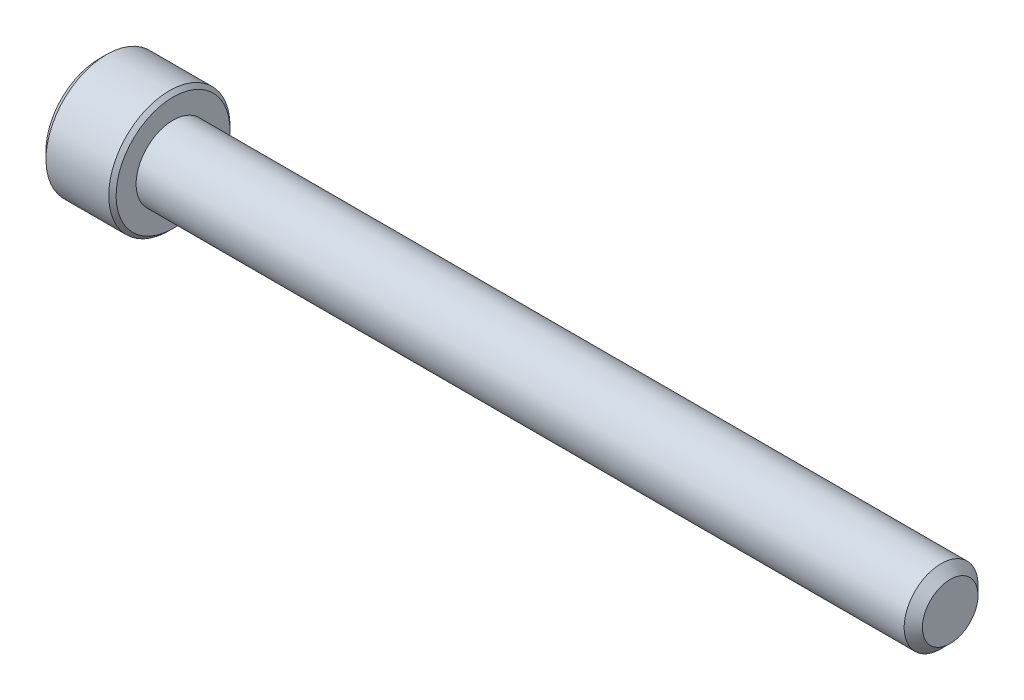
ISO-10303-21;
HEADER;
FILE_DESCRIPTION(('STEP AP214'),'2;1');
FILE_NAME('part.step','',(''),(''),'','','');
FILE_SCHEMA(('AUTOMOTIVE_DESIGN { 1 0 10303 214 1 1 1 1 }'));
ENDSEC;
DATA;
#1=APPLICATION_CONTEXT('core data for automotive mechanical design processes');
#2=APPLICATION_PROTOCOL_DEFINITION('international standard','automotive_design',2000,#1);
#3=PRODUCT_CONTEXT('',#1,'mechanical');
#4=PRODUCT('Part','Part','',(#3));
#5=PRODUCT_RELATED_PRODUCT_CATEGORY('part','',(#4));
#6=PRODUCT_DEFINITION_FORMATION('','',#4);
#7=PRODUCT_DEFINITION_CONTEXT('part definition',#1,'design');
#8=PRODUCT_DEFINITION('design','',#6,#7);
#9=PRODUCT_DEFINITION_SHAPE('','',#8);
#10=(LENGTH_UNIT() NAMED_UNIT(*) SI_UNIT(.MILLI.,.METRE.));
#11=(NAMED_UNIT(*) PLANE_ANGLE_UNIT() SI_UNIT($,.RADIAN.));
#12=(NAMED_UNIT(*) SI_UNIT($,.STERADIAN.) SOLID_ANGLE_UNIT());
#13=UNCERTAINTY_MEASURE_WITH_UNIT(LENGTH_MEASURE(1.E-05),#10,'distance_accuracy_value','');
#14=(GEOMETRIC_REPRESENTATION_CONTEXT(3) GLOBAL_UNCERTAINTY_ASSIGNED_CONTEXT((#13)) GLOBAL_UNIT_ASSIGNED_CONTEXT((#10,
#11,#12)) REPRESENTATION_CONTEXT('',''));
#15=CARTESIAN_POINT('',(0.,0.,0.));
#16=DIRECTION('',(0.,0.,1.));
#17=DIRECTION('',(1.,0.,0.));
#18=AXIS2_PLACEMENT_3D('',#15,#16,#17);
#19=CARTESIAN_POINT('',(-30.226,3.47979999999999,0.));
#20=DIRECTION('',(-1.,0.,0.));
#21=DIRECTION('',(0.,-1.,0.));
#22=AXIS2_PLACEMENT_3D('',#19,#20,#21);
#23=PLANE('',#22);
#24=CARTESIAN_POINT('',(-30.226,0.,0.));
#25=DIRECTION('',(-1.,0.,0.));
#26=DIRECTION('',(0.,-1.,0.));
#27=AXIS2_PLACEMENT_3D('',#24,#25,#26);
#28=CIRCLE('',#27,2.28769270663693);
#29=CARTESIAN_POINT('',(-30.226,-2.28769270663684,-2.28983498828939E-13));
#30=VERTEX_POINT('',#29);
#31=CARTESIAN_POINT('',(-30.226,-1.14384635331858,1.98119999999985));
#32=VERTEX_POINT('',#31);
#33=EDGE_CURVE('E129',#30,#32,#28,.T.);
#34=ORIENTED_EDGE('',*,*,#33,.F.);
#35=CARTESIAN_POINT('',(-30.226,-1.14384635331849,-1.9812));
#36=VERTEX_POINT('',#35);
#37=EDGE_CURVE('E128',#36,#30,#28,.T.);
#38=ORIENTED_EDGE('',*,*,#37,.F.);
#39=CARTESIAN_POINT('',(-30.226,1.14384635331849,-1.9812));
#40=VERTEX_POINT('',#39);
#41=EDGE_CURVE('E98',#40,#36,#28,.T.);
#42=ORIENTED_EDGE('',*,*,#41,.F.);
#43=CARTESIAN_POINT('',(-30.226,2.28769270663702,0.));
#44=VERTEX_POINT('',#43);
#45=EDGE_CURVE('E91',#44,#40,#28,.T.);
#46=ORIENTED_EDGE('',*,*,#45,.F.);
#47=CARTESIAN_POINT('',(-30.226,1.14384635331848,1.9812));
#48=VERTEX_POINT('',#47);
#49=EDGE_CURVE('E52',#48,#44,#28,.T.);
#50=ORIENTED_EDGE('',*,*,#49,.F.);
#51=EDGE_CURVE('E59',#32,#48,#28,.T.);
#52=ORIENTED_EDGE('',*,*,#51,.F.);
#53=EDGE_LOOP('',(#34,#38,#42,#46,#50,#52));
#54=FACE_BOUND('',#53,.T.);
#55=CARTESIAN_POINT('',(-30.226,0.,0.));
#56=DIRECTION('',(1.,0.,0.));
#57=DIRECTION('',(0.,1.,0.));
#58=AXIS2_PLACEMENT_3D('',#55,#56,#57);
#59=CIRCLE('',#58,3.4798);
#60=CARTESIAN_POINT('',(-30.226,3.47979999999999,0.));
#61=VERTEX_POINT('',#60);
#62=EDGE_CURVE('E222',#61,#61,#59,.T.);
#63=ORIENTED_EDGE('',*,*,#62,.F.);
#64=EDGE_LOOP('',(#63));
#65=FACE_BOUND('',#64,.T.);
#66=ADVANCED_FACE('F32',(#54,#65),#23,.T.);
#67=CARTESIAN_POINT('',(-25.4,0.,0.));
#68=DIRECTION('',(1.,0.,0.));
#69=DIRECTION('',(0.,0.,-1.));
#70=AXIS2_PLACEMENT_3D('',#67,#68,#69);
#71=CYLINDRICAL_SURFACE('',#70,2.41299999999999);
#72=CARTESIAN_POINT('',(24.8046875,0.,0.));
#73=DIRECTION('',(1.,0.,0.));
#74=DIRECTION('',(0.,0.,-1.));
#75=AXIS2_PLACEMENT_3D('',#72,#73,#74);
#76=CIRCLE('',#75,2.41299999999999);
#77=CARTESIAN_POINT('',(24.8046875,0.,-2.41299999999999));
#78=VERTEX_POINT('',#77);
#79=EDGE_CURVE('E46',#78,#78,#76,.F.);
#80=ORIENTED_EDGE('',*,*,#79,.T.);
#81=EDGE_LOOP('',(#80));
#82=FACE_BOUND('',#81,.T.);
#83=CARTESIAN_POINT('',(-25.4,0.,0.));
#84=DIRECTION('',(1.,0.,0.));
#85=DIRECTION('',(0.,1.,0.));
#86=AXIS2_PLACEMENT_3D('',#83,#84,#85);
#87=CIRCLE('',#86,2.41299999999999);
#88=CARTESIAN_POINT('',(-25.4,2.41299999999999,0.));
#89=VERTEX_POINT('',#88);
#90=EDGE_CURVE('E215',#89,#89,#87,.F.);
#91=ORIENTED_EDGE('',*,*,#90,.F.);
#92=EDGE_LOOP('',(#91));
#93=FACE_BOUND('',#92,.T.);
#94=ADVANCED_FACE('F195',(#82,#93),#71,.T.);
#95=CARTESIAN_POINT('',(25.4,0.,0.));
#96=DIRECTION('',(1.,0.,0.));
#97=DIRECTION('',(0.,0.,-1.));
#98=AXIS2_PLACEMENT_3D('',#95,#96,#97);
#99=PLANE('',#98);
#100=CARTESIAN_POINT('',(25.4,0.,0.));
#101=DIRECTION('',(1.,0.,0.));
#102=DIRECTION('',(0.,0.,-1.));
#103=AXIS2_PLACEMENT_3D('',#100,#101,#102);
#104=CIRCLE('',#103,1.81768749999999);
#105=CARTESIAN_POINT('',(25.4,0.,-1.81768749999999));
#106=VERTEX_POINT('',#105);
#107=EDGE_CURVE('E216',#106,#106,#104,.T.);
#108=ORIENTED_EDGE('',*,*,#107,.T.);
#109=EDGE_LOOP('',(#108));
#110=FACE_BOUND('',#109,.T.);
#111=ADVANCED_FACE('F203',(#110),#99,.T.);
#112=CARTESIAN_POINT('',(25.4,0.,0.));
#113=DIRECTION('',(-1.,0.,0.));
#114=DIRECTION('',(0.,0.,1.));
#115=AXIS2_PLACEMENT_3D('',#112,#113,#114);
#116=CONICAL_SURFACE('',#115,1.81768749999999,0.785398163397445);
#117=ORIENTED_EDGE('',*,*,#79,.F.);
#118=EDGE_LOOP('',(#117));
#119=FACE_BOUND('',#118,.T.);
#120=ORIENTED_EDGE('',*,*,#107,.F.);
#121=EDGE_LOOP('',(#120));
#122=FACE_BOUND('',#121,.T.);
#123=ADVANCED_FACE('F34',(#119,#122),#116,.T.);
#124=CARTESIAN_POINT('',(-25.4,0.,0.));
#125=DIRECTION('',(1.,0.,0.));
#126=DIRECTION('',(0.,1.,0.));
#127=AXIS2_PLACEMENT_3D('',#124,#125,#126);
#128=CYLINDRICAL_SURFACE('',#127,3.9624);
#129=CARTESIAN_POINT('',(-29.7434,0.,0.));
#130=DIRECTION('',(1.,0.,0.));
#131=DIRECTION('',(0.,1.,0.));
#132=AXIS2_PLACEMENT_3D('',#129,#130,#131);
#133=CIRCLE('',#132,3.9624);
#134=CARTESIAN_POINT('',(-29.7434,3.96239999999999,0.));
#135=VERTEX_POINT('',#134);
#136=EDGE_CURVE('E217',#135,#135,#133,.T.);
#137=ORIENTED_EDGE('',*,*,#136,.T.);
#138=EDGE_LOOP('',(#137));
#139=FACE_BOUND('',#138,.T.);
#140=CARTESIAN_POINT('',(-25.6413,0.,0.));
#141=DIRECTION('',(1.,0.,0.));
#142=DIRECTION('',(0.,1.,0.));
#143=AXIS2_PLACEMENT_3D('',#140,#141,#142);
#144=CIRCLE('',#143,3.9624);
#145=CARTESIAN_POINT('',(-25.6413,3.9624,0.));
#146=VERTEX_POINT('',#145);
#147=EDGE_CURVE('E230',#146,#146,#144,.T.);
#148=ORIENTED_EDGE('',*,*,#147,.F.);
#149=EDGE_LOOP('',(#148));
#150=FACE_BOUND('',#149,.T.);
#151=ADVANCED_FACE('F198',(#139,#150),#128,.T.);
#152=CARTESIAN_POINT('',(-29.7434,0.,0.));
#153=DIRECTION('',(1.,0.,0.));
#154=DIRECTION('',(0.,1.,0.));
#155=AXIS2_PLACEMENT_3D('',#152,#153,#154);
#156=CONICAL_SURFACE('',#155,3.9624,0.785398163397451);
#157=ORIENTED_EDGE('',*,*,#62,.T.);
#158=EDGE_LOOP('',(#157));
#159=FACE_BOUND('',#158,.T.);
#160=ORIENTED_EDGE('',*,*,#136,.F.);
#161=EDGE_LOOP('',(#160));
#162=FACE_BOUND('',#161,.T.);
#163=ADVANCED_FACE('F191',(#159,#162),#156,.T.);
#164=CARTESIAN_POINT('',(-25.4,3.7211,0.));
#165=DIRECTION('',(1.,0.,0.));
#166=DIRECTION('',(0.,1.,0.));
#167=AXIS2_PLACEMENT_3D('',#164,#165,#166);
#168=PLANE('',#167);
#169=ORIENTED_EDGE('',*,*,#90,.T.);
#170=EDGE_LOOP('',(#169));
#171=FACE_BOUND('',#170,.T.);
#172=CARTESIAN_POINT('',(-25.4,0.,0.));
#173=DIRECTION('',(1.,0.,0.));
#174=DIRECTION('',(0.,1.,0.));
#175=AXIS2_PLACEMENT_3D('',#172,#173,#174);
#176=CIRCLE('',#175,3.7211);
#177=CARTESIAN_POINT('',(-25.4,3.7211,0.));
#178=VERTEX_POINT('',#177);
#179=EDGE_CURVE('E227',#178,#178,#176,.T.);
#180=ORIENTED_EDGE('',*,*,#179,.T.);
#181=EDGE_LOOP('',(#180));
#182=FACE_BOUND('',#181,.T.);
#183=ADVANCED_FACE('F187',(#171,#182),#168,.T.);
#184=CARTESIAN_POINT('',(-25.4,0.,0.));
#185=DIRECTION('',(-1.,0.,0.));
#186=DIRECTION('',(0.,-1.,0.));
#187=AXIS2_PLACEMENT_3D('',#184,#185,#186);
#188=CONICAL_SURFACE('',#187,3.7211,0.785398163397448);
#189=ORIENTED_EDGE('',*,*,#147,.T.);
#190=EDGE_LOOP('',(#189));
#191=FACE_BOUND('',#190,.T.);
#192=ORIENTED_EDGE('',*,*,#179,.F.);
#193=EDGE_LOOP('',(#192));
#194=FACE_BOUND('',#193,.T.);
#195=ADVANCED_FACE('F151',(#191,#194),#188,.T.);
#196=CARTESIAN_POINT('',(-30.226,0.,0.));
#197=DIRECTION('',(-1.,0.,0.));
#198=DIRECTION('',(0.,-1.,0.));
#199=AXIS2_PLACEMENT_3D('',#196,#197,#198);
#200=CONICAL_SURFACE('',#199,2.28769270663693,0.78539816339745);
#201=CARTESIAN_POINT('',(-30.9865600777253,-2.31661209471328,-1.9812));
#202=CARTESIAN_POINT('',(-30.9438204101819,-2.2603614921634,-1.9812));
#203=CARTESIAN_POINT('',(-30.9014834228159,-2.20379992870606,-1.9812));
#204=CARTESIAN_POINT('',(-30.8177963532882,-2.08993070629047,-1.9812));
#205=CARTESIAN_POINT('',(-30.7764465165402,-2.03262286716362,-1.9812));
#206=CARTESIAN_POINT('',(-30.6946210740377,-1.91671767305173,-1.9812));
#207=CARTESIAN_POINT('',(-30.6541547119404,-1.85811377040503,-1.9812));
#208=CARTESIAN_POINT('',(-30.5746970580368,-1.73991751157362,-1.9812));
#209=CARTESIAN_POINT('',(-30.5357056629739,-1.68032522500334,-1.9812));
#210=CARTESIAN_POINT('',(-30.4572729813758,-1.55642857644237,-1.9812));
#211=CARTESIAN_POINT('',(-30.4179417996365,-1.49205415836947,-1.9812));
#212=CARTESIAN_POINT('',(-30.3418158217768,-1.36179799931495,-1.9812));
#213=CARTESIAN_POINT('',(-30.3050214801781,-1.29591599102244,-1.9812));
#214=CARTESIAN_POINT('',(-30.2347629165456,-1.16264841649047,-1.9812));
#215=CARTESIAN_POINT('',(-30.2012886854463,-1.0952681686377,-1.9812));
#216=CARTESIAN_POINT('',(-30.138413001948,-0.958638525880334,-1.9812));
#217=CARTESIAN_POINT('',(-30.1090101814703,-0.889389768225114,-1.9812));
#218=CARTESIAN_POINT('',(-30.0576670535846,-0.755011676695663,-1.9812));
#219=CARTESIAN_POINT('',(-30.0353004028526,-0.690046933259605,-1.9812));
#220=CARTESIAN_POINT('',(-29.9957743614793,-0.558522492136708,-1.9812));
#221=CARTESIAN_POINT('',(-29.9786153199098,-0.491962687853753,-1.9812));
#222=CARTESIAN_POINT('',(-29.9506968812676,-0.358769834003339,-1.9812));
#223=CARTESIAN_POINT('',(-29.9398256504206,-0.292160618416791,-1.9812));
#224=CARTESIAN_POINT('',(-29.9246994731351,-0.158191123948832,-1.9812));
#225=CARTESIAN_POINT('',(-29.9204433141166,-0.0908309849964722,-1.9812));
#226=CARTESIAN_POINT('',(-29.9188791538644,0.0413675255867977,-1.9812));
#227=CARTESIAN_POINT('',(-29.9213092898238,0.106202871329352,-1.9812));
#228=CARTESIAN_POINT('',(-29.9323974368111,0.235335017945305,-1.9812));
#229=CARTESIAN_POINT('',(-29.9410560404723,0.29963176698271,-1.9812));
#230=CARTESIAN_POINT('',(-29.9642695211888,0.428310374608979,-1.9812));
#231=CARTESIAN_POINT('',(-29.9789259856142,0.49267362119119,-1.9812));
#232=CARTESIAN_POINT('',(-30.0133456029653,0.619989310450822,-1.9812));
#233=CARTESIAN_POINT('',(-30.0331083735679,0.682941858367764,-1.9812));
#234=CARTESIAN_POINT('',(-30.1023096371758,0.879557414350363,-1.9812));
#235=CARTESIAN_POINT('',(-30.1595631983677,1.010461173405,-1.9812));
#236=CARTESIAN_POINT('',(-30.2869025411665,1.26614292755427,-1.9812));
#237=CARTESIAN_POINT('',(-30.3570341080232,1.39089698474677,-1.9812));
#238=CARTESIAN_POINT('',(-30.4665063539928,1.57122009754463,-1.9812));
#239=CARTESIAN_POINT('',(-30.502693344133,1.62874196367695,-1.9812));
#240=CARTESIAN_POINT('',(-30.5766029768938,1.7427982585636,-1.9812));
#241=CARTESIAN_POINT('',(-30.614325735426,1.7993326123238,-1.9812));
#242=CARTESIAN_POINT('',(-30.6907156093157,1.9110856137449,-1.9812));
#243=CARTESIAN_POINT('',(-30.729372617531,1.96631120499262,-1.9812));
#244=CARTESIAN_POINT('',(-30.8077142557783,2.07600654074471,-1.9812));
#245=CARTESIAN_POINT('',(-30.8473985999833,2.13047648914331,-1.9812));
#246=CARTESIAN_POINT('',(-30.8875039684054,2.18462985150372,-1.9812));
#247=B_SPLINE_CURVE_WITH_KNOTS('',3,(#201,#202,#203,#204,#205,#206,#207,#208,#209,#210,#211,
#212,#213,#214,#215,#216,#217,#218,#219,#220,#221,#222,#223,#224,#225,#226,#227,#228,#229,#230,
#231,#232,#233,#234,#235,#236,#237,#238,#239,#240,#241,#242,#243,#244,#245,#246),.UNSPECIFIED.,
.F.,.F.,(4,2,2,2,2,2,2,2,2,2,2,2,2,2,2,2,2,2,2,2,2,2,4),(0.,0.211941073069259,0.423934298979966,
0.637568344044446,0.851187405675866,1.07745720435395,1.30376743866492,1.52937324449064,
1.75490305715753,1.96084491037234,2.16680056504197,2.36897057443679,2.57110352055404,
2.76543396935549,2.95978291097833,3.15756960318855,3.35534149086081,3.7827240030036,
4.21165649261164,4.41551067240027,4.61938026665561,4.82160076405436,5.02376559149012),.UNSPECIFIED.);
#248=EDGE_CURVE('E11',#36,#40,#247,.T.);
#249=ORIENTED_EDGE('',*,*,#248,.T.);
#250=ORIENTED_EDGE('',*,*,#41,.T.);
#251=EDGE_LOOP('',(#249,#250));
#252=FACE_BOUND('',#251,.T.);
#253=ADVANCED_FACE('F103',(#252),#200,.F.);
#254=CARTESIAN_POINT('',(-30.226115478796,-2.28780817669081,0.000200000000000626));
#255=CARTESIAN_POINT('',(-30.1868257959103,-2.24848665761523,-0.0679068688696919));
#256=CARTESIAN_POINT('',(-30.1498435003289,-2.20850761153497,-0.137152607918836));
#257=CARTESIAN_POINT('',(-30.0821295256354,-2.12698582564064,-0.27835248301157));
#258=CARTESIAN_POINT('',(-30.0514355270599,-2.08543533121811,-0.350320050431004));
#259=CARTESIAN_POINT('',(-29.998855956616,-2.00165072213424,-0.495439250256557));
#260=CARTESIAN_POINT('',(-29.9768382144166,-1.95943794971066,-0.568553916822545));
#261=CARTESIAN_POINT('',(-29.9429151727618,-1.87408300871192,-0.716393011309414));
#262=CARTESIAN_POINT('',(-29.9309845470076,-1.83094344831493,-0.791112921733183));
#263=CARTESIAN_POINT('',(-29.9202201335962,-1.75659617238784,-0.919886181043241));
#264=CARTESIAN_POINT('',(-29.9186264854144,-1.72548453026022,-0.973773125915175));
#265=CARTESIAN_POINT('',(-29.9213101205948,-1.6633120865558,-1.08145895724194));
#266=CARTESIAN_POINT('',(-29.9255894623054,-1.63225130662553,-1.1352578062039));
#267=CARTESIAN_POINT('',(-29.9397755575124,-1.57042301642569,-1.24234754617512));
#268=CARTESIAN_POINT('',(-29.9496886071672,-1.53965587350492,-1.29563780091763));
#269=CARTESIAN_POINT('',(-29.9745979595727,-1.478653620299,-1.40129680284647));
#270=CARTESIAN_POINT('',(-29.9895938726795,-1.44841846941905,-1.45366562034505));
#271=CARTESIAN_POINT('',(-30.0341153639915,-1.37096856578664,-1.58781278847771));
#272=CARTESIAN_POINT('',(-30.066997840542,-1.32423416327347,-1.66875914809188));
#273=CARTESIAN_POINT('',(-30.1225083779863,-1.25551545359429,-1.78778344468681));
#274=CARTESIAN_POINT('',(-30.1420122911182,-1.23286958858003,-1.82700723347285));
#275=CARTESIAN_POINT('',(-30.1827981146138,-1.18799738117061,-1.90472817655373));
#276=CARTESIAN_POINT('',(-30.2040789329533,-1.16577079125223,-1.94322575957137));
#277=CARTESIAN_POINT('',(-30.2261154787959,-1.14373088326465,-1.9814));
#278=B_SPLINE_CURVE_WITH_KNOTS('',3,(#254,#255,#256,#257,#258,#259,#260,#261,#262,#263,#264,
#265,#266,#267,#268,#269,#270,#271,#272,#273,#274,#275,#276,#277),.UNSPECIFIED.,.F.,.F.,(4,2,2,
2,2,2,2,2,2,2,2,4),(0.,0.26391677446681,0.529371490731501,0.790609676105219,1.0511899914388,
1.23765676959447,1.42418891677611,1.61092994095409,1.79765665311273,2.09428646526811,
2.24219924134225,2.39002177516371),.UNSPECIFIED.);
#279=EDGE_CURVE('E131',#30,#36,#278,.T.);
#280=ORIENTED_EDGE('',*,*,#279,.T.);
#281=ORIENTED_EDGE('',*,*,#37,.T.);
#282=EDGE_LOOP('',(#280,#281));
#283=FACE_BOUND('',#282,.T.);
#284=ADVANCED_FACE('F150',(#283),#200,.F.);
#285=CARTESIAN_POINT('',(-30.2261154787959,-1.14373088326465,1.9814));
#286=CARTESIAN_POINT('',(-30.1868257959103,-1.18305240234023,1.91329313113031));
#287=CARTESIAN_POINT('',(-30.1498435003289,-1.22303144842048,1.84404739208117));
#288=CARTESIAN_POINT('',(-30.0821295256354,-1.30455323431481,1.70284751698845));
#289=CARTESIAN_POINT('',(-30.0514355270599,-1.34610372873734,1.63087994956902));
#290=CARTESIAN_POINT('',(-29.998855956616,-1.4298883378212,1.48576074974348));
#291=CARTESIAN_POINT('',(-29.9768382144166,-1.47210111024478,1.41264608317749));
#292=CARTESIAN_POINT('',(-29.9429151727618,-1.55745605124351,1.26480698869063));
#293=CARTESIAN_POINT('',(-29.9309845470076,-1.6005956116405,1.19008707826687));
#294=CARTESIAN_POINT('',(-29.9202201335962,-1.67494288756758,1.06131381895682));
#295=CARTESIAN_POINT('',(-29.9186264854144,-1.7060545296952,1.00742687408489));
#296=CARTESIAN_POINT('',(-29.9213101205948,-1.76822697339962,0.899741042758116));
#297=CARTESIAN_POINT('',(-29.9255894623054,-1.7992877533299,0.845942193796162));
#298=CARTESIAN_POINT('',(-29.9397755575124,-1.86111604352973,0.738852453824941));
#299=CARTESIAN_POINT('',(-29.9496886071672,-1.8918831864505,0.685562199082431));
#300=CARTESIAN_POINT('',(-29.9745979595727,-1.95288543965642,0.579903197153589));
#301=CARTESIAN_POINT('',(-29.9895938726795,-1.98312059053637,0.527534379655012));
#302=CARTESIAN_POINT('',(-30.0341153639915,-2.06057049416879,0.393387211522345));
#303=CARTESIAN_POINT('',(-30.066997840542,-2.10730489668196,0.312440851908158));
#304=CARTESIAN_POINT('',(-30.1225083779863,-2.17602360636116,0.193416555313217));
#305=CARTESIAN_POINT('',(-30.1420122911183,-2.19866947137542,0.154192766527168));
#306=CARTESIAN_POINT('',(-30.1827981146138,-2.24354167878484,0.0764718234462845));
#307=CARTESIAN_POINT('',(-30.2040789329534,-2.26576826870323,0.0379742404286397));
#308=CARTESIAN_POINT('',(-30.226115478796,-2.28780817669081,-0.000199999999999317));
#309=B_SPLINE_CURVE_WITH_KNOTS('',3,(#285,#286,#287,#288,#289,#290,#291,#292,#293,#294,#295,
#296,#297,#298,#299,#300,#301,#302,#303,#304,#305,#306,#307,#308),.UNSPECIFIED.,.F.,.F.,(4,2,2,
2,2,2,2,2,2,2,2,4),(0.,0.263916774466789,0.529371490731459,0.790609676105157,1.05118999143872,
1.23765676959439,1.42418891677603,1.61092994095401,1.79765665311265,2.09428646526807,
2.24219924134222,2.39002177516371),.UNSPECIFIED.);
#310=EDGE_CURVE('E138',#32,#30,#309,.T.);
#311=ORIENTED_EDGE('',*,*,#310,.T.);
#312=ORIENTED_EDGE('',*,*,#33,.T.);
#313=EDGE_LOOP('',(#311,#312));
#314=FACE_BOUND('',#313,.T.);
#315=ADVANCED_FACE('F263',(#314),#200,.F.);
#316=CARTESIAN_POINT('',(-30.9865600777253,-2.31661209471328,1.9812));
#317=CARTESIAN_POINT('',(-30.9438204101819,-2.2603614921634,1.9812));
#318=CARTESIAN_POINT('',(-30.9014834228159,-2.20379992870606,1.9812));
#319=CARTESIAN_POINT('',(-30.8177963532882,-2.08993070629047,1.9812));
#320=CARTESIAN_POINT('',(-30.7764465165402,-2.03262286716362,1.9812));
#321=CARTESIAN_POINT('',(-30.6946210740377,-1.91671767305173,1.9812));
#322=CARTESIAN_POINT('',(-30.6541547119404,-1.85811377040503,1.9812));
#323=CARTESIAN_POINT('',(-30.5746970580368,-1.73991751157362,1.9812));
#324=CARTESIAN_POINT('',(-30.5357056629739,-1.68032522500334,1.9812));
#325=CARTESIAN_POINT('',(-30.4572729813758,-1.55642857644236,1.9812));
#326=CARTESIAN_POINT('',(-30.4179417996365,-1.49205415836946,1.9812));
#327=CARTESIAN_POINT('',(-30.3418158217768,-1.36179799931495,1.9812));
#328=CARTESIAN_POINT('',(-30.3050214801781,-1.29591599102244,1.9812));
#329=CARTESIAN_POINT('',(-30.2347629165456,-1.16264841649047,1.9812));
#330=CARTESIAN_POINT('',(-30.2012886854463,-1.0952681686377,1.9812));
#331=CARTESIAN_POINT('',(-30.138413001948,-0.958638525880333,1.9812));
#332=CARTESIAN_POINT('',(-30.1090101814703,-0.889389768225113,1.9812));
#333=CARTESIAN_POINT('',(-30.0576670535846,-0.755011676695662,1.9812));
#334=CARTESIAN_POINT('',(-30.0353004028526,-0.690046933259604,1.9812));
#335=CARTESIAN_POINT('',(-29.9957743614793,-0.558522492136708,1.9812));
#336=CARTESIAN_POINT('',(-29.9786153199098,-0.491962687853753,1.9812));
#337=CARTESIAN_POINT('',(-29.9506968812676,-0.358769834003338,1.9812));
#338=CARTESIAN_POINT('',(-29.9398256504206,-0.29216061841679,1.9812));
#339=CARTESIAN_POINT('',(-29.9246994731351,-0.158191123948831,1.9812));
#340=CARTESIAN_POINT('',(-29.9204433141166,-0.0908309849964716,1.9812));
#341=CARTESIAN_POINT('',(-29.9188791538644,0.0413675255867983,1.9812));
#342=CARTESIAN_POINT('',(-29.9213092898238,0.106202871329353,1.9812));
#343=CARTESIAN_POINT('',(-29.9323974368111,0.235335017945306,1.9812));
#344=CARTESIAN_POINT('',(-29.9410560404723,0.299631766982712,1.9812));
#345=CARTESIAN_POINT('',(-29.9642695211888,0.42831037460898,1.9812));
#346=CARTESIAN_POINT('',(-29.9789259856142,0.492673621191191,1.9812));
#347=CARTESIAN_POINT('',(-30.0133456029653,0.619989310450822,1.9812));
#348=CARTESIAN_POINT('',(-30.0331083735679,0.682941858367764,1.9812));
#349=CARTESIAN_POINT('',(-30.1023096371758,0.879557414350363,1.9812));
#350=CARTESIAN_POINT('',(-30.1595631983677,1.010461173405,1.9812));
#351=CARTESIAN_POINT('',(-30.2869025411665,1.26614292755427,1.9812));
#352=CARTESIAN_POINT('',(-30.3570341080232,1.39089698474677,1.9812));
#353=CARTESIAN_POINT('',(-30.4665063539928,1.57122009754463,1.9812));
#354=CARTESIAN_POINT('',(-30.502693344133,1.62874196367695,1.9812));
#355=CARTESIAN_POINT('',(-30.5766029768938,1.74279825856359,1.9812));
#356=CARTESIAN_POINT('',(-30.614325735426,1.79933261232379,1.9812));
#357=CARTESIAN_POINT('',(-30.6907156093157,1.9110856137449,1.9812));
#358=CARTESIAN_POINT('',(-30.729372617531,1.96631120499263,1.9812));
#359=CARTESIAN_POINT('',(-30.8077142557783,2.07600654074471,1.9812));
#360=CARTESIAN_POINT('',(-30.8473985999833,2.13047648914331,1.9812));
#361=CARTESIAN_POINT('',(-30.8875039684054,2.18462985150372,1.9812));
#362=B_SPLINE_CURVE_WITH_KNOTS('',3,(#316,#317,#318,#319,#320,#321,#322,#323,#324,#325,#326,
#327,#328,#329,#330,#331,#332,#333,#334,#335,#336,#337,#338,#339,#340,#341,#342,#343,#344,#345,
#346,#347,#348,#349,#350,#351,#352,#353,#354,#355,#356,#357,#358,#359,#360,#361),.UNSPECIFIED.,
.F.,.F.,(4,2,2,2,2,2,2,2,2,2,2,2,2,2,2,2,2,2,2,2,2,2,4),(0.,0.211941073069259,0.423934298979966,
0.637568344044446,0.851187405675866,1.07745720435396,1.30376743866492,1.52937324449064,
1.75490305715753,1.96084491037234,2.16680056504197,2.36897057443679,2.57110352055404,
2.76543396935549,2.95978291097833,3.15756960318855,3.35534149086081,3.78272400300359,
4.21165649261164,4.41551067240027,4.6193802666556,4.82160076405436,5.02376559149011),.UNSPECIFIED.);
#363=EDGE_CURVE('E158',#48,#32,#362,.F.);
#364=ORIENTED_EDGE('',*,*,#363,.T.);
#365=ORIENTED_EDGE('',*,*,#51,.T.);
#366=EDGE_LOOP('',(#364,#365));
#367=FACE_BOUND('',#366,.T.);
#368=ADVANCED_FACE('F279',(#367),#200,.F.);
#369=CARTESIAN_POINT('',(-30.2261154787958,2.28780817669081,-0.000199999999999572));
#370=CARTESIAN_POINT('',(-30.1868257959102,2.24848665761523,0.0679068688696886));
#371=CARTESIAN_POINT('',(-30.1498435003287,2.20850761153498,0.137152607918827));
#372=CARTESIAN_POINT('',(-30.0821295256353,2.12698582564065,0.278352483011551));
#373=CARTESIAN_POINT('',(-30.0514355270598,2.08543533121812,0.350320050430979));
#374=CARTESIAN_POINT('',(-29.9988559566158,2.00165072213426,0.495439250256521));
#375=CARTESIAN_POINT('',(-29.9768382144164,1.95943794971068,0.568553916822504));
#376=CARTESIAN_POINT('',(-29.9429151727616,1.87408300871195,0.716393011309361));
#377=CARTESIAN_POINT('',(-29.9309845470074,1.83094344831496,0.791112921733124));
#378=CARTESIAN_POINT('',(-29.9202201335961,1.75659617238788,0.919886181043174));
#379=CARTESIAN_POINT('',(-29.9186264854143,1.72548453026026,0.973773125915103));
#380=CARTESIAN_POINT('',(-29.9213101205947,1.66331208655585,1.08145895724186));
#381=CARTESIAN_POINT('',(-29.9255894623052,1.63225130662558,1.13525780620382));
#382=CARTESIAN_POINT('',(-29.9397755575122,1.57042301642575,1.24234754617503));
#383=CARTESIAN_POINT('',(-29.949688607167,1.53965587350498,1.29563780091754));
#384=CARTESIAN_POINT('',(-29.9745979595725,1.47865362029906,1.40129680284637));
#385=CARTESIAN_POINT('',(-29.9895938726794,1.44841846941911,1.45366562034494));
#386=CARTESIAN_POINT('',(-30.0341153639914,1.37096856578669,1.58781278847762));
#387=CARTESIAN_POINT('',(-30.0669978405418,1.32423416327351,1.66875914809181));
#388=CARTESIAN_POINT('',(-30.1225083779862,1.25551545359431,1.78778344468677));
#389=CARTESIAN_POINT('',(-30.1420122911181,1.23286958858005,1.82700723347282));
#390=CARTESIAN_POINT('',(-30.1827981146137,1.18799738117062,1.90472817655371));
#391=CARTESIAN_POINT('',(-30.2040789329532,1.16577079125223,1.94322575957136));
#392=CARTESIAN_POINT('',(-30.2261154787958,1.14373088326465,1.9814));
#393=B_SPLINE_CURVE_WITH_KNOTS('',3,(#369,#370,#371,#372,#373,#374,#375,#376,#377,#378,#379,
#380,#381,#382,#383,#384,#385,#386,#387,#388,#389,#390,#391,#392),.UNSPECIFIED.,.F.,.F.,(4,2,2,
2,2,2,2,2,2,2,2,4),(0.,0.263916774466789,0.52937149073146,0.790609676105156,1.05118999143872,
1.23765676959438,1.424188916776,1.61092994095397,1.7976566531126,2.09428646526805,
2.24219924134222,2.39002177516373),.UNSPECIFIED.);
#394=EDGE_CURVE('E118',#44,#48,#393,.T.);
#395=ORIENTED_EDGE('',*,*,#394,.T.);
#396=ORIENTED_EDGE('',*,*,#49,.T.);
#397=EDGE_LOOP('',(#395,#396));
#398=FACE_BOUND('',#397,.T.);
#399=ADVANCED_FACE('F255',(#398),#200,.F.);
#400=CARTESIAN_POINT('',(-30.2261154787958,1.14373088326465,-1.9814));
#401=CARTESIAN_POINT('',(-30.1868257959102,1.18305240234023,-1.91329313113031));
#402=CARTESIAN_POINT('',(-30.1498435003288,1.22303144842049,-1.84404739208116));
#403=CARTESIAN_POINT('',(-30.0821295256353,1.30455323431482,-1.70284751698843));
#404=CARTESIAN_POINT('',(-30.0514355270598,1.34610372873735,-1.630879949569));
#405=CARTESIAN_POINT('',(-29.9988559566158,1.42988833782121,-1.48576074974345));
#406=CARTESIAN_POINT('',(-29.9768382144164,1.4721011102448,-1.41264608317746));
#407=CARTESIAN_POINT('',(-29.9429151727616,1.55745605124354,-1.26480698869059));
#408=CARTESIAN_POINT('',(-29.9309845470074,1.60059561164053,-1.19008707826682));
#409=CARTESIAN_POINT('',(-29.9202201335961,1.67494288756761,-1.06131381895677));
#410=CARTESIAN_POINT('',(-29.9186264854143,1.70605452969523,-1.00742687408484));
#411=CARTESIAN_POINT('',(-29.9213101205947,1.76822697339964,-0.899741042758073));
#412=CARTESIAN_POINT('',(-29.9255894623052,1.79928775332992,-0.845942193796122));
#413=CARTESIAN_POINT('',(-29.9397755575122,1.86111604352975,-0.738852453824907));
#414=CARTESIAN_POINT('',(-29.949688607167,1.89188318645052,-0.685562199082401));
#415=CARTESIAN_POINT('',(-29.9745979595725,1.95288543965644,-0.579903197153566));
#416=CARTESIAN_POINT('',(-29.9895938726794,1.98312059053638,-0.527534379654992));
#417=CARTESIAN_POINT('',(-30.0341153639913,2.0605704941688,-0.39338721152233));
#418=CARTESIAN_POINT('',(-30.0669978405418,2.10730489668197,-0.312440851908145));
#419=CARTESIAN_POINT('',(-30.1225083779862,2.17602360636116,-0.193416555313208));
#420=CARTESIAN_POINT('',(-30.1420122911181,2.19866947137542,-0.154192766527159));
#421=CARTESIAN_POINT('',(-30.1827981146136,2.24354167878484,-0.0764718234462791));
#422=CARTESIAN_POINT('',(-30.2040789329532,2.26576826870323,-0.0379742404286363));
#423=CARTESIAN_POINT('',(-30.2261154787958,2.28780817669081,0.000200000000000555));
#424=B_SPLINE_CURVE_WITH_KNOTS('',3,(#400,#401,#402,#403,#404,#405,#406,#407,#408,#409,#410,
#411,#412,#413,#414,#415,#416,#417,#418,#419,#420,#421,#422,#423),.UNSPECIFIED.,.F.,.F.,(4,2,2,
2,2,2,2,2,2,2,2,4),(0.,0.263916774466809,0.529371490731501,0.790609676105218,1.0511899914388,
1.23765676959446,1.42418891677608,1.61092994095405,1.79765665311268,2.0942864652681,
2.24219924134225,2.39002177516373),.UNSPECIFIED.);
#425=EDGE_CURVE('E94',#40,#44,#424,.T.);
#426=ORIENTED_EDGE('',*,*,#425,.T.);
#427=ORIENTED_EDGE('',*,*,#45,.T.);
#428=EDGE_LOOP('',(#426,#427));
#429=FACE_BOUND('',#428,.T.);
#430=ADVANCED_FACE('F92',(#429),#200,.F.);
#431=CARTESIAN_POINT('',(-27.94,2.28769270663697,0.));
#432=DIRECTION('',(1.,0.,0.));
#433=DIRECTION('',(0.,0.,-1.));
#434=AXIS2_PLACEMENT_3D('',#431,#432,#433);
#435=PLANE('',#434);
#436=DIRECTION('',(0.,0.5,0.866025403784439));
#437=VECTOR('',#436,1.);
#438=CARTESIAN_POINT('',(-27.94,1.14384635331849,-1.9812));
#439=LINE('',#438,#437);
#440=CARTESIAN_POINT('',(-27.94,1.14384635331849,-1.9812));
#441=VERTEX_POINT('',#440);
#442=CARTESIAN_POINT('',(-27.94,2.28769270663697,0.));
#443=VERTEX_POINT('',#442);
#444=EDGE_CURVE('E117',#441,#443,#439,.T.);
#445=ORIENTED_EDGE('',*,*,#444,.F.);
#446=DIRECTION('',(0.,1.,0.));
#447=VECTOR('',#446,1.);
#448=CARTESIAN_POINT('',(-27.94,-1.14384635331849,-1.9812));
#449=LINE('',#448,#447);
#450=CARTESIAN_POINT('',(-27.94,-1.14384635331849,-1.9812));
#451=VERTEX_POINT('',#450);
#452=EDGE_CURVE('E122',#451,#441,#449,.T.);
#453=ORIENTED_EDGE('',*,*,#452,.F.);
#454=DIRECTION('',(0.,0.5,-0.866025403784439));
#455=VECTOR('',#454,1.);
#456=CARTESIAN_POINT('',(-27.94,-2.28769270663697,0.));
#457=LINE('',#456,#455);
#458=CARTESIAN_POINT('',(-27.94,-2.28769270663697,0.));
#459=VERTEX_POINT('',#458);
#460=EDGE_CURVE('E245',#459,#451,#457,.T.);
#461=ORIENTED_EDGE('',*,*,#460,.F.);
#462=DIRECTION('',(0.,-0.5,-0.866025403784439));
#463=VECTOR('',#462,1.);
#464=CARTESIAN_POINT('',(-27.94,-1.14384635331849,1.9812));
#465=LINE('',#464,#463);
#466=CARTESIAN_POINT('',(-27.94,-1.14384635331849,1.9812));
#467=VERTEX_POINT('',#466);
#468=EDGE_CURVE('E247',#467,#459,#465,.T.);
#469=ORIENTED_EDGE('',*,*,#468,.F.);
#470=DIRECTION('',(0.,-1.,0.));
#471=VECTOR('',#470,1.);
#472=CARTESIAN_POINT('',(-27.94,1.14384635331849,1.9812));
#473=LINE('',#472,#471);
#474=CARTESIAN_POINT('',(-27.94,1.14384635331849,1.9812));
#475=VERTEX_POINT('',#474);
#476=EDGE_CURVE('E249',#475,#467,#473,.T.);
#477=ORIENTED_EDGE('',*,*,#476,.F.);
#478=DIRECTION('',(0.,-0.5,0.866025403784439));
#479=VECTOR('',#478,1.);
#480=CARTESIAN_POINT('',(-27.94,2.28769270663697,0.));
#481=LINE('',#480,#479);
#482=EDGE_CURVE('E251',#443,#475,#481,.T.);
#483=ORIENTED_EDGE('',*,*,#482,.F.);
#484=EDGE_LOOP('',(#445,#453,#461,#469,#477,#483));
#485=FACE_BOUND('',#484,.T.);
#486=ADVANCED_FACE('F152',(#485),#435,.F.);
#487=CARTESIAN_POINT('',(-27.94,-1.14384635331849,-1.9812));
#488=DIRECTION('',(0.,0.,1.));
#489=DIRECTION('',(1.,0.,0.));
#490=AXIS2_PLACEMENT_3D('',#487,#488,#489);
#491=PLANE('',#490);
#492=ORIENTED_EDGE('',*,*,#248,.F.);
#493=DIRECTION('',(-1.,0.,0.));
#494=VECTOR('',#493,1.);
#495=CARTESIAN_POINT('',(-27.94,-1.14384635331849,-1.9812));
#496=LINE('',#495,#494);
#497=EDGE_CURVE('E123',#451,#36,#496,.T.);
#498=ORIENTED_EDGE('',*,*,#497,.F.);
#499=ORIENTED_EDGE('',*,*,#452,.T.);
#500=DIRECTION('',(-1.,0.,0.));
#501=VECTOR('',#500,1.);
#502=CARTESIAN_POINT('',(-27.94,1.14384635331849,-1.9812));
#503=LINE('',#502,#501);
#504=EDGE_CURVE('E113',#441,#40,#503,.T.);
#505=ORIENTED_EDGE('',*,*,#504,.T.);
#506=EDGE_LOOP('',(#492,#498,#499,#505));
#507=FACE_BOUND('',#506,.T.);
#508=ADVANCED_FACE('F120',(#507),#491,.T.);
#509=CARTESIAN_POINT('',(-27.94,-2.28769270663697,0.));
#510=DIRECTION('',(0.,0.866025403784439,0.5));
#511=DIRECTION('',(0.,-0.5,0.866025403784439));
#512=AXIS2_PLACEMENT_3D('',#509,#510,#511);
#513=PLANE('',#512);
#514=ORIENTED_EDGE('',*,*,#279,.F.);
#515=DIRECTION('',(-1.,0.,0.));
#516=VECTOR('',#515,1.);
#517=CARTESIAN_POINT('',(-27.94,-2.28769270663697,0.));
#518=LINE('',#517,#516);
#519=EDGE_CURVE('E240',#459,#30,#518,.T.);
#520=ORIENTED_EDGE('',*,*,#519,.F.);
#521=ORIENTED_EDGE('',*,*,#460,.T.);
#522=ORIENTED_EDGE('',*,*,#497,.T.);
#523=EDGE_LOOP('',(#514,#520,#521,#522));
#524=FACE_BOUND('',#523,.T.);
#525=ADVANCED_FACE('F145',(#524),#513,.T.);
#526=CARTESIAN_POINT('',(-27.94,-1.14384635331849,1.9812));
#527=DIRECTION('',(0.,0.866025403784439,-0.5));
#528=DIRECTION('',(0.,0.5,0.866025403784439));
#529=AXIS2_PLACEMENT_3D('',#526,#527,#528);
#530=PLANE('',#529);
#531=ORIENTED_EDGE('',*,*,#310,.F.);
#532=DIRECTION('',(-1.,0.,0.));
#533=VECTOR('',#532,1.);
#534=CARTESIAN_POINT('',(-27.94,-1.14384635331849,1.9812));
#535=LINE('',#534,#533);
#536=EDGE_CURVE('E237',#467,#32,#535,.T.);
#537=ORIENTED_EDGE('',*,*,#536,.F.);
#538=ORIENTED_EDGE('',*,*,#468,.T.);
#539=ORIENTED_EDGE('',*,*,#519,.T.);
#540=EDGE_LOOP('',(#531,#537,#538,#539));
#541=FACE_BOUND('',#540,.T.);
#542=ADVANCED_FACE('F269',(#541),#530,.T.);
#543=CARTESIAN_POINT('',(-27.94,1.14384635331849,1.9812));
#544=DIRECTION('',(0.,0.,-1.));
#545=DIRECTION('',(-1.,0.,0.));
#546=AXIS2_PLACEMENT_3D('',#543,#544,#545);
#547=PLANE('',#546);
#548=ORIENTED_EDGE('',*,*,#363,.F.);
#549=DIRECTION('',(-1.,0.,0.));
#550=VECTOR('',#549,1.);
#551=CARTESIAN_POINT('',(-27.94,1.14384635331849,1.9812));
#552=LINE('',#551,#550);
#553=EDGE_CURVE('E234',#475,#48,#552,.T.);
#554=ORIENTED_EDGE('',*,*,#553,.F.);
#555=ORIENTED_EDGE('',*,*,#476,.T.);
#556=ORIENTED_EDGE('',*,*,#536,.T.);
#557=EDGE_LOOP('',(#548,#554,#555,#556));
#558=FACE_BOUND('',#557,.T.);
#559=ADVANCED_FACE('F179',(#558),#547,.T.);
#560=CARTESIAN_POINT('',(-27.94,2.28769270663697,0.));
#561=DIRECTION('',(0.,-0.866025403784439,-0.5));
#562=DIRECTION('',(0.,0.5,-0.866025403784439));
#563=AXIS2_PLACEMENT_3D('',#560,#561,#562);
#564=PLANE('',#563);
#565=ORIENTED_EDGE('',*,*,#394,.F.);
#566=DIRECTION('',(-1.,0.,0.));
#567=VECTOR('',#566,1.);
#568=CARTESIAN_POINT('',(-27.94,2.28769270663697,0.));
#569=LINE('',#568,#567);
#570=EDGE_CURVE('E116',#443,#44,#569,.T.);
#571=ORIENTED_EDGE('',*,*,#570,.F.);
#572=ORIENTED_EDGE('',*,*,#482,.T.);
#573=ORIENTED_EDGE('',*,*,#553,.T.);
#574=EDGE_LOOP('',(#565,#571,#572,#573));
#575=FACE_BOUND('',#574,.T.);
#576=ADVANCED_FACE('F176',(#575),#564,.T.);
#577=CARTESIAN_POINT('',(-27.94,1.14384635331849,-1.9812));
#578=DIRECTION('',(0.,-0.866025403784439,0.5));
#579=DIRECTION('',(0.,-0.5,-0.866025403784439));
#580=AXIS2_PLACEMENT_3D('',#577,#578,#579);
#581=PLANE('',#580);
#582=ORIENTED_EDGE('',*,*,#425,.F.);
#583=ORIENTED_EDGE('',*,*,#504,.F.);
#584=ORIENTED_EDGE('',*,*,#444,.T.);
#585=ORIENTED_EDGE('',*,*,#570,.T.);
#586=EDGE_LOOP('',(#582,#583,#584,#585));
#587=FACE_BOUND('',#586,.T.);
#588=ADVANCED_FACE('F111',(#587),#581,.T.);
#589=CLOSED_SHELL('',(#66,#94,#111,#123,#151,#163,#183,#195,#253,#284,#315,#368,#399,#430,#486,
#508,#525,#542,#559,#576,#588));
#590=MANIFOLD_SOLID_BREP('B2',#589);
#591=ADVANCED_BREP_SHAPE_REPRESENTATION('',(#18,#590),#14);
#592=SHAPE_DEFINITION_REPRESENTATION(#9,#591);
ENDSEC;
END-ISO-10303-21;
